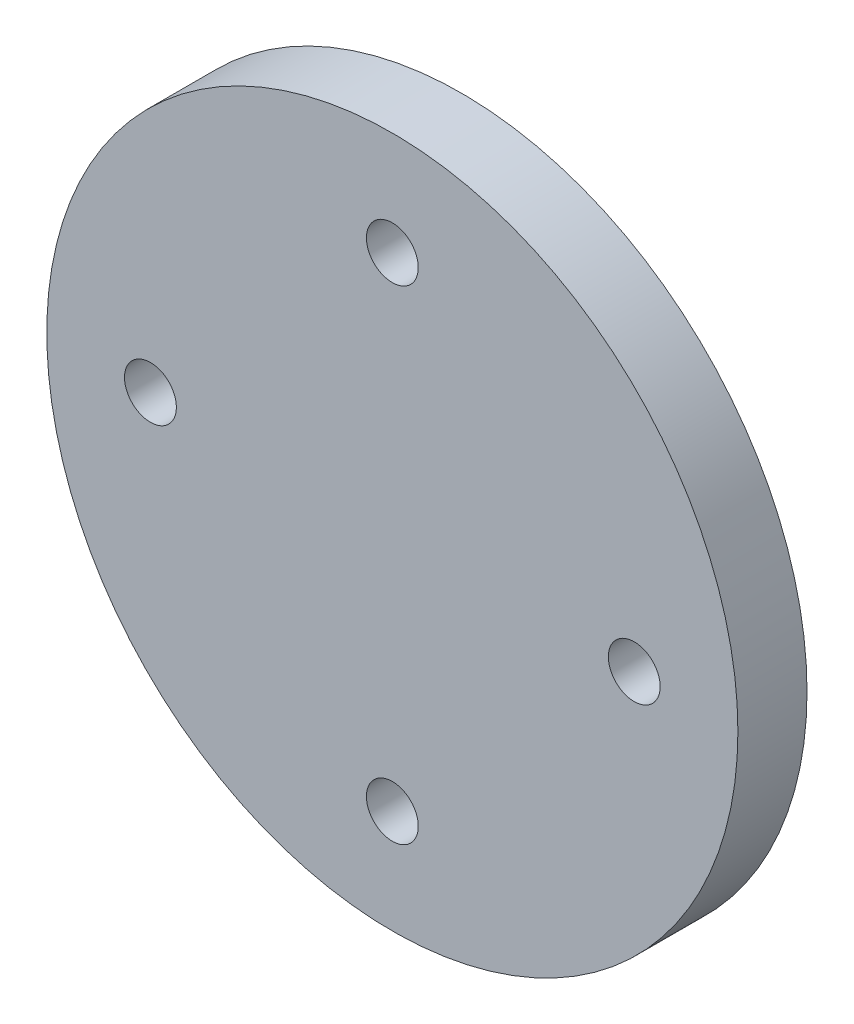
ISO-10303-21;
HEADER;
FILE_DESCRIPTION(('STEP AP214'),'2;1');
FILE_NAME('part.step','',(''),(''),'','','');
FILE_SCHEMA(('AUTOMOTIVE_DESIGN { 1 0 10303 214 1 1 1 1 }'));
ENDSEC;
DATA;
#1=APPLICATION_CONTEXT('core data for automotive mechanical design processes');
#2=APPLICATION_PROTOCOL_DEFINITION('international standard','automotive_design',2000,#1);
#3=PRODUCT_CONTEXT('',#1,'mechanical');
#4=PRODUCT('Part','Part','',(#3));
#5=PRODUCT_RELATED_PRODUCT_CATEGORY('part','',(#4));
#6=PRODUCT_DEFINITION_FORMATION('','',#4);
#7=PRODUCT_DEFINITION_CONTEXT('part definition',#1,'design');
#8=PRODUCT_DEFINITION('design','',#6,#7);
#9=PRODUCT_DEFINITION_SHAPE('','',#8);
#10=(LENGTH_UNIT() NAMED_UNIT(*) SI_UNIT(.MILLI.,.METRE.));
#11=(NAMED_UNIT(*) PLANE_ANGLE_UNIT() SI_UNIT($,.RADIAN.));
#12=(NAMED_UNIT(*) SI_UNIT($,.STERADIAN.) SOLID_ANGLE_UNIT());
#13=UNCERTAINTY_MEASURE_WITH_UNIT(LENGTH_MEASURE(1.E-05),#10,'distance_accuracy_value','');
#14=(GEOMETRIC_REPRESENTATION_CONTEXT(3) GLOBAL_UNCERTAINTY_ASSIGNED_CONTEXT((#13)) GLOBAL_UNIT_ASSIGNED_CONTEXT((#10,
#11,#12)) REPRESENTATION_CONTEXT('',''));
#15=CARTESIAN_POINT('',(0.,0.,0.));
#16=DIRECTION('',(0.,0.,1.));
#17=DIRECTION('',(1.,0.,0.));
#18=AXIS2_PLACEMENT_3D('',#15,#16,#17);
#19=CARTESIAN_POINT('',(0.,0.,2.));
#20=DIRECTION('',(0.,0.,-1.));
#21=DIRECTION('',(-1.,0.,0.));
#22=AXIS2_PLACEMENT_3D('',#19,#20,#21);
#23=CYLINDRICAL_SURFACE('',#22,10.);
#24=CARTESIAN_POINT('',(0.,0.,2.));
#25=DIRECTION('',(0.,0.,1.));
#26=DIRECTION('',(1.,0.,0.));
#27=AXIS2_PLACEMENT_3D('',#24,#25,#26);
#28=CIRCLE('',#27,10.);
#29=CARTESIAN_POINT('',(10.,0.,2.));
#30=VERTEX_POINT('',#29);
#31=EDGE_CURVE('E51',#30,#30,#28,.T.);
#32=ORIENTED_EDGE('',*,*,#31,.F.);
#33=EDGE_LOOP('',(#32));
#34=FACE_BOUND('',#33,.T.);
#35=CARTESIAN_POINT('',(0.,0.,0.));
#36=DIRECTION('',(0.,0.,1.));
#37=DIRECTION('',(1.,0.,0.));
#38=AXIS2_PLACEMENT_3D('',#35,#36,#37);
#39=CIRCLE('',#38,10.);
#40=CARTESIAN_POINT('',(10.,0.,0.));
#41=VERTEX_POINT('',#40);
#42=EDGE_CURVE('E46',#41,#41,#39,.T.);
#43=ORIENTED_EDGE('',*,*,#42,.T.);
#44=EDGE_LOOP('',(#43));
#45=FACE_BOUND('',#44,.T.);
#46=ADVANCED_FACE('F43',(#34,#45),#23,.T.);
#47=CARTESIAN_POINT('',(0.,0.,2.));
#48=DIRECTION('',(0.,0.,1.));
#49=DIRECTION('',(1.,0.,0.));
#50=AXIS2_PLACEMENT_3D('',#47,#48,#49);
#51=PLANE('',#50);
#52=CARTESIAN_POINT('',(-2.29152765431188E-13,7.,2.));
#53=DIRECTION('',(0.,0.,-1.));
#54=DIRECTION('',(-1.,0.,0.));
#55=AXIS2_PLACEMENT_3D('',#52,#53,#54);
#56=CIRCLE('',#55,0.75);
#57=CARTESIAN_POINT('',(-0.750000000000229,7.,2.));
#58=VERTEX_POINT('',#57);
#59=EDGE_CURVE('E67',#58,#58,#56,.T.);
#60=ORIENTED_EDGE('',*,*,#59,.T.);
#61=EDGE_LOOP('',(#60));
#62=FACE_BOUND('',#61,.T.);
#63=CARTESIAN_POINT('',(-7.00000000000016,0.,2.));
#64=DIRECTION('',(0.,0.,-1.));
#65=DIRECTION('',(-1.,0.,0.));
#66=AXIS2_PLACEMENT_3D('',#63,#64,#65);
#67=CIRCLE('',#66,0.749999999999999);
#68=CARTESIAN_POINT('',(-7.75000000000016,0.,2.));
#69=VERTEX_POINT('',#68);
#70=EDGE_CURVE('E87',#69,#69,#67,.T.);
#71=ORIENTED_EDGE('',*,*,#70,.T.);
#72=EDGE_LOOP('',(#71));
#73=FACE_BOUND('',#72,.T.);
#74=CARTESIAN_POINT('',(0.,-7.,2.));
#75=DIRECTION('',(0.,0.,-1.));
#76=DIRECTION('',(-1.,0.,0.));
#77=AXIS2_PLACEMENT_3D('',#74,#75,#76);
#78=CIRCLE('',#77,0.75);
#79=CARTESIAN_POINT('',(-0.750000000000084,-7.,2.));
#80=VERTEX_POINT('',#79);
#81=EDGE_CURVE('E79',#80,#80,#78,.T.);
#82=ORIENTED_EDGE('',*,*,#81,.T.);
#83=EDGE_LOOP('',(#82));
#84=FACE_BOUND('',#83,.T.);
#85=CARTESIAN_POINT('',(6.99999999999984,0.,2.));
#86=DIRECTION('',(0.,0.,-1.));
#87=DIRECTION('',(-1.,0.,0.));
#88=AXIS2_PLACEMENT_3D('',#85,#86,#87);
#89=CIRCLE('',#88,0.749999999999999);
#90=CARTESIAN_POINT('',(6.24999999999984,0.,2.));
#91=VERTEX_POINT('',#90);
#92=EDGE_CURVE('E71',#91,#91,#89,.T.);
#93=ORIENTED_EDGE('',*,*,#92,.T.);
#94=EDGE_LOOP('',(#93));
#95=FACE_BOUND('',#94,.T.);
#96=ORIENTED_EDGE('',*,*,#31,.T.);
#97=EDGE_LOOP('',(#96));
#98=FACE_BOUND('',#97,.T.);
#99=ADVANCED_FACE('F103',(#62,#73,#84,#95,#98),#51,.T.);
#100=CARTESIAN_POINT('',(0.,0.,0.));
#101=DIRECTION('',(0.,0.,1.));
#102=DIRECTION('',(1.,0.,0.));
#103=AXIS2_PLACEMENT_3D('',#100,#101,#102);
#104=PLANE('',#103);
#105=CARTESIAN_POINT('',(-2.29152765431188E-13,7.,0.));
#106=DIRECTION('',(0.,0.,-1.));
#107=DIRECTION('',(-1.,0.,0.));
#108=AXIS2_PLACEMENT_3D('',#105,#106,#107);
#109=CIRCLE('',#108,0.75);
#110=CARTESIAN_POINT('',(-0.750000000000229,7.,0.));
#111=VERTEX_POINT('',#110);
#112=EDGE_CURVE('E95',#111,#111,#109,.T.);
#113=ORIENTED_EDGE('',*,*,#112,.F.);
#114=EDGE_LOOP('',(#113));
#115=FACE_BOUND('',#114,.T.);
#116=CARTESIAN_POINT('',(-7.00000000000016,0.,0.));
#117=DIRECTION('',(0.,0.,-1.));
#118=DIRECTION('',(-1.,0.,0.));
#119=AXIS2_PLACEMENT_3D('',#116,#117,#118);
#120=CIRCLE('',#119,0.749999999999999);
#121=CARTESIAN_POINT('',(-7.75000000000016,0.,0.));
#122=VERTEX_POINT('',#121);
#123=EDGE_CURVE('E91',#122,#122,#120,.T.);
#124=ORIENTED_EDGE('',*,*,#123,.F.);
#125=EDGE_LOOP('',(#124));
#126=FACE_BOUND('',#125,.T.);
#127=CARTESIAN_POINT('',(0.,-7.,0.));
#128=DIRECTION('',(0.,0.,-1.));
#129=DIRECTION('',(-1.,0.,0.));
#130=AXIS2_PLACEMENT_3D('',#127,#128,#129);
#131=CIRCLE('',#130,0.75);
#132=CARTESIAN_POINT('',(-0.750000000000084,-7.,0.));
#133=VERTEX_POINT('',#132);
#134=EDGE_CURVE('E83',#133,#133,#131,.T.);
#135=ORIENTED_EDGE('',*,*,#134,.F.);
#136=EDGE_LOOP('',(#135));
#137=FACE_BOUND('',#136,.T.);
#138=CARTESIAN_POINT('',(6.99999999999984,0.,0.));
#139=DIRECTION('',(0.,0.,-1.));
#140=DIRECTION('',(-1.,0.,0.));
#141=AXIS2_PLACEMENT_3D('',#138,#139,#140);
#142=CIRCLE('',#141,0.749999999999999);
#143=CARTESIAN_POINT('',(6.24999999999984,0.,0.));
#144=VERTEX_POINT('',#143);
#145=EDGE_CURVE('E75',#144,#144,#142,.T.);
#146=ORIENTED_EDGE('',*,*,#145,.F.);
#147=EDGE_LOOP('',(#146));
#148=FACE_BOUND('',#147,.T.);
#149=CARTESIAN_POINT('',(0.,0.,0.));
#150=DIRECTION('',(0.,0.,-1.));
#151=DIRECTION('',(-1.,0.,0.));
#152=AXIS2_PLACEMENT_3D('',#149,#150,#151);
#153=CIRCLE('',#152,4.);
#154=CARTESIAN_POINT('',(-4.,0.,0.));
#155=VERTEX_POINT('',#154);
#156=EDGE_CURVE('E10',#155,#155,#153,.T.);
#157=ORIENTED_EDGE('',*,*,#156,.F.);
#158=EDGE_LOOP('',(#157));
#159=FACE_BOUND('',#158,.T.);
#160=ORIENTED_EDGE('',*,*,#42,.F.);
#161=EDGE_LOOP('',(#160));
#162=FACE_BOUND('',#161,.T.);
#163=ADVANCED_FACE('F113',(#115,#126,#137,#148,#159,#162),#104,.F.);
#164=CARTESIAN_POINT('',(0.,0.,-2.));
#165=DIRECTION('',(0.,0.,1.));
#166=DIRECTION('',(1.,0.,0.));
#167=AXIS2_PLACEMENT_3D('',#164,#165,#166);
#168=CYLINDRICAL_SURFACE('',#167,4.);
#169=CARTESIAN_POINT('',(0.,0.,-2.));
#170=DIRECTION('',(0.,0.,-1.));
#171=DIRECTION('',(-1.,0.,0.));
#172=AXIS2_PLACEMENT_3D('',#169,#170,#171);
#173=CIRCLE('',#172,4.);
#174=CARTESIAN_POINT('',(-4.,0.,-2.));
#175=VERTEX_POINT('',#174);
#176=EDGE_CURVE('E58',#175,#175,#173,.T.);
#177=ORIENTED_EDGE('',*,*,#176,.F.);
#178=EDGE_LOOP('',(#177));
#179=FACE_BOUND('',#178,.T.);
#180=ORIENTED_EDGE('',*,*,#156,.T.);
#181=EDGE_LOOP('',(#180));
#182=FACE_BOUND('',#181,.T.);
#183=ADVANCED_FACE('F116',(#179,#182),#168,.T.);
#184=CARTESIAN_POINT('',(0.,0.,-2.));
#185=DIRECTION('',(0.,0.,-1.));
#186=DIRECTION('',(-1.,0.,0.));
#187=AXIS2_PLACEMENT_3D('',#184,#185,#186);
#188=PLANE('',#187);
#189=CARTESIAN_POINT('',(0.,0.,-2.));
#190=DIRECTION('',(0.,0.,-1.));
#191=DIRECTION('',(-1.,0.,0.));
#192=AXIS2_PLACEMENT_3D('',#189,#190,#191);
#193=CIRCLE('',#192,3.05);
#194=CARTESIAN_POINT('',(-3.05,0.,-2.));
#195=VERTEX_POINT('',#194);
#196=EDGE_CURVE('E63',#195,#195,#193,.T.);
#197=ORIENTED_EDGE('',*,*,#196,.F.);
#198=EDGE_LOOP('',(#197));
#199=FACE_BOUND('',#198,.T.);
#200=ORIENTED_EDGE('',*,*,#176,.T.);
#201=EDGE_LOOP('',(#200));
#202=FACE_BOUND('',#201,.T.);
#203=ADVANCED_FACE('F142',(#199,#202),#188,.T.);
#204=CARTESIAN_POINT('',(0.,0.,1.5));
#205=DIRECTION('',(0.,0.,-1.));
#206=DIRECTION('',(-1.,0.,0.));
#207=AXIS2_PLACEMENT_3D('',#204,#205,#206);
#208=CYLINDRICAL_SURFACE('',#207,3.05);
#209=CARTESIAN_POINT('',(0.,0.,1.5));
#210=DIRECTION('',(0.,0.,-1.));
#211=DIRECTION('',(-1.,0.,0.));
#212=AXIS2_PLACEMENT_3D('',#209,#210,#211);
#213=CIRCLE('',#212,3.05);
#214=CARTESIAN_POINT('',(-3.05,0.,1.5));
#215=VERTEX_POINT('',#214);
#216=EDGE_CURVE('E62',#215,#215,#213,.T.);
#217=ORIENTED_EDGE('',*,*,#216,.F.);
#218=EDGE_LOOP('',(#217));
#219=FACE_BOUND('',#218,.T.);
#220=ORIENTED_EDGE('',*,*,#196,.T.);
#221=EDGE_LOOP('',(#220));
#222=FACE_BOUND('',#221,.T.);
#223=ADVANCED_FACE('F146',(#219,#222),#208,.F.);
#224=CARTESIAN_POINT('',(0.,0.,1.5));
#225=DIRECTION('',(0.,0.,-1.));
#226=DIRECTION('',(-1.,0.,0.));
#227=AXIS2_PLACEMENT_3D('',#224,#225,#226);
#228=PLANE('',#227);
#229=ORIENTED_EDGE('',*,*,#216,.T.);
#230=EDGE_LOOP('',(#229));
#231=FACE_BOUND('',#230,.T.);
#232=ADVANCED_FACE('F150',(#231),#228,.T.);
#233=CARTESIAN_POINT('',(6.99999999999984,0.,2.));
#234=DIRECTION('',(0.,0.,-1.));
#235=DIRECTION('',(-1.,0.,0.));
#236=AXIS2_PLACEMENT_3D('',#233,#234,#235);
#237=CYLINDRICAL_SURFACE('',#236,0.749999999999999);
#238=ORIENTED_EDGE('',*,*,#92,.F.);
#239=EDGE_LOOP('',(#238));
#240=FACE_BOUND('',#239,.T.);
#241=ORIENTED_EDGE('',*,*,#145,.T.);
#242=EDGE_LOOP('',(#241));
#243=FACE_BOUND('',#242,.T.);
#244=ADVANCED_FACE('F153',(#240,#243),#237,.F.);
#245=CARTESIAN_POINT('',(0.,-7.,2.));
#246=DIRECTION('',(0.,0.,-1.));
#247=DIRECTION('',(-1.,0.,0.));
#248=AXIS2_PLACEMENT_3D('',#245,#246,#247);
#249=CYLINDRICAL_SURFACE('',#248,0.75);
#250=ORIENTED_EDGE('',*,*,#81,.F.);
#251=EDGE_LOOP('',(#250));
#252=FACE_BOUND('',#251,.T.);
#253=ORIENTED_EDGE('',*,*,#134,.T.);
#254=EDGE_LOOP('',(#253));
#255=FACE_BOUND('',#254,.T.);
#256=ADVANCED_FACE('F157',(#252,#255),#249,.F.);
#257=CARTESIAN_POINT('',(-7.00000000000016,0.,2.));
#258=DIRECTION('',(0.,0.,-1.));
#259=DIRECTION('',(-1.,0.,0.));
#260=AXIS2_PLACEMENT_3D('',#257,#258,#259);
#261=CYLINDRICAL_SURFACE('',#260,0.749999999999999);
#262=ORIENTED_EDGE('',*,*,#70,.F.);
#263=EDGE_LOOP('',(#262));
#264=FACE_BOUND('',#263,.T.);
#265=ORIENTED_EDGE('',*,*,#123,.T.);
#266=EDGE_LOOP('',(#265));
#267=FACE_BOUND('',#266,.T.);
#268=ADVANCED_FACE('F109',(#264,#267),#261,.F.);
#269=CARTESIAN_POINT('',(-2.29152765431188E-13,7.,2.));
#270=DIRECTION('',(0.,0.,-1.));
#271=DIRECTION('',(-1.,0.,0.));
#272=AXIS2_PLACEMENT_3D('',#269,#270,#271);
#273=CYLINDRICAL_SURFACE('',#272,0.75);
#274=ORIENTED_EDGE('',*,*,#59,.F.);
#275=EDGE_LOOP('',(#274));
#276=FACE_BOUND('',#275,.T.);
#277=ORIENTED_EDGE('',*,*,#112,.T.);
#278=EDGE_LOOP('',(#277));
#279=FACE_BOUND('',#278,.T.);
#280=ADVANCED_FACE('F106',(#276,#279),#273,.F.);
#281=CLOSED_SHELL('',(#46,#99,#163,#183,#203,#223,#232,#244,#256,#268,#280));
#282=MANIFOLD_SOLID_BREP('B2',#281);
#283=ADVANCED_BREP_SHAPE_REPRESENTATION('',(#18,#282),#14);
#284=SHAPE_DEFINITION_REPRESENTATION(#9,#283);
ENDSEC;
END-ISO-10303-21;
